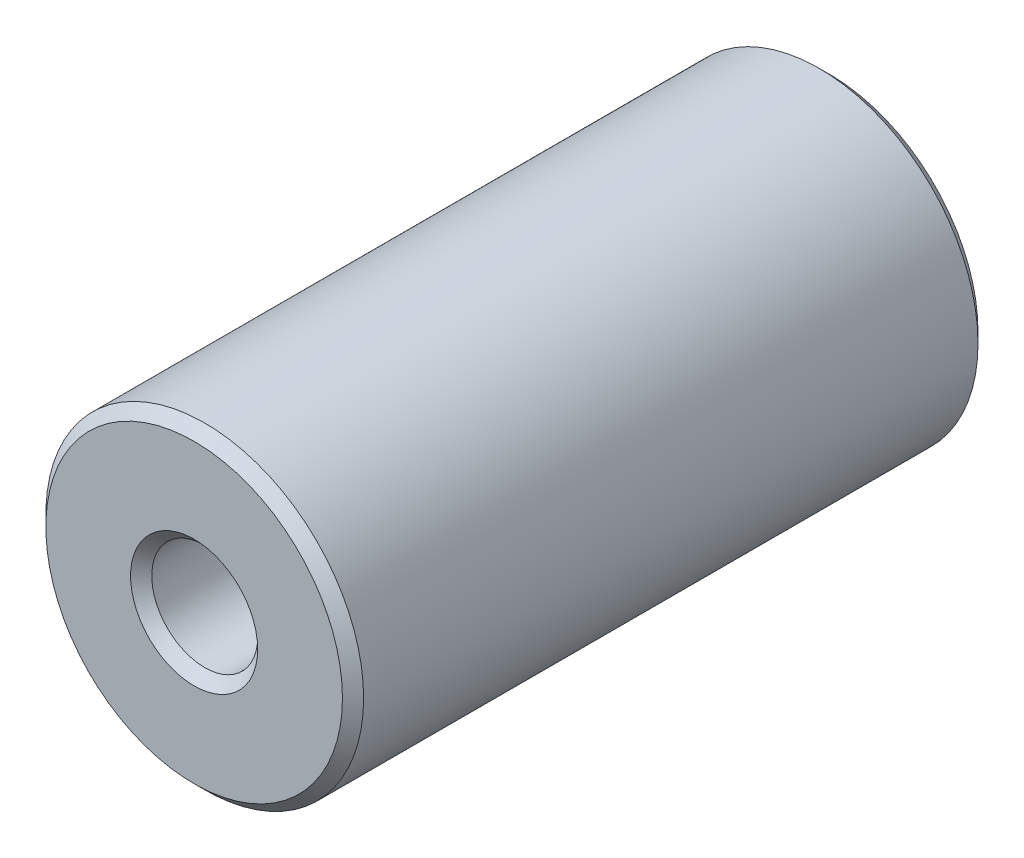
ISO-10303-21;
HEADER;
FILE_DESCRIPTION(('STEP AP214'),'2;1');
FILE_NAME('part.step','',(''),(''),'','','');
FILE_SCHEMA(('AUTOMOTIVE_DESIGN { 1 0 10303 214 1 1 1 1 }'));
ENDSEC;
DATA;
#1=APPLICATION_CONTEXT('core data for automotive mechanical design processes');
#2=APPLICATION_PROTOCOL_DEFINITION('international standard','automotive_design',2000,#1);
#3=PRODUCT_CONTEXT('',#1,'mechanical');
#4=PRODUCT('Part','Part','',(#3));
#5=PRODUCT_RELATED_PRODUCT_CATEGORY('part','',(#4));
#6=PRODUCT_DEFINITION_FORMATION('','',#4);
#7=PRODUCT_DEFINITION_CONTEXT('part definition',#1,'design');
#8=PRODUCT_DEFINITION('design','',#6,#7);
#9=PRODUCT_DEFINITION_SHAPE('','',#8);
#10=(LENGTH_UNIT() NAMED_UNIT(*) SI_UNIT(.MILLI.,.METRE.));
#11=(NAMED_UNIT(*) PLANE_ANGLE_UNIT() SI_UNIT($,.RADIAN.));
#12=(NAMED_UNIT(*) SI_UNIT($,.STERADIAN.) SOLID_ANGLE_UNIT());
#13=UNCERTAINTY_MEASURE_WITH_UNIT(LENGTH_MEASURE(1.E-05),#10,'distance_accuracy_value','');
#14=(GEOMETRIC_REPRESENTATION_CONTEXT(3) GLOBAL_UNCERTAINTY_ASSIGNED_CONTEXT((#13)) GLOBAL_UNIT_ASSIGNED_CONTEXT((#10,
#11,#12)) REPRESENTATION_CONTEXT('',''));
#15=CARTESIAN_POINT('',(0.,0.,0.));
#16=DIRECTION('',(0.,0.,1.));
#17=DIRECTION('',(1.,0.,0.));
#18=AXIS2_PLACEMENT_3D('',#15,#16,#17);
#19=CARTESIAN_POINT('',(0.,0.,0.));
#20=DIRECTION('',(0.,0.,-1.));
#21=DIRECTION('',(1.,0.,0.));
#22=AXIS2_PLACEMENT_3D('',#19,#20,#21);
#23=CYLINDRICAL_SURFACE('',#22,1.);
#24=DIRECTION('',(0.,0.,1.));
#25=VECTOR('',#24,1.);
#26=CARTESIAN_POINT('',(1.,0.,0.));
#27=LINE('',#26,#25);
#28=CARTESIAN_POINT('',(1.,0.,0.2));
#29=VERTEX_POINT('',#28);
#30=CARTESIAN_POINT('',(1.,0.,11.8));
#31=VERTEX_POINT('',#30);
#32=EDGE_CURVE('E10',#29,#31,#27,.T.);
#33=ORIENTED_EDGE('',*,*,#32,.F.);
#34=CARTESIAN_POINT('',(0.,0.,0.2));
#35=DIRECTION('',(0.,0.,1.));
#36=DIRECTION('',(1.,0.,0.));
#37=AXIS2_PLACEMENT_3D('',#34,#35,#36);
#38=CIRCLE('',#37,1.);
#39=EDGE_CURVE('E94',#29,#29,#38,.T.);
#40=ORIENTED_EDGE('',*,*,#39,.F.);
#41=ORIENTED_EDGE('',*,*,#32,.T.);
#42=CARTESIAN_POINT('',(0.,0.,11.8));
#43=DIRECTION('',(0.,0.,-1.));
#44=DIRECTION('',(1.,0.,0.));
#45=AXIS2_PLACEMENT_3D('',#42,#43,#44);
#46=CIRCLE('',#45,1.);
#47=EDGE_CURVE('E115',#31,#31,#46,.T.);
#48=ORIENTED_EDGE('',*,*,#47,.F.);
#49=EDGE_LOOP('',(#33,#40,#41,#48));
#50=FACE_BOUND('',#49,.T.);
#51=ADVANCED_FACE('F16',(#50),#23,.F.);
#52=CARTESIAN_POINT('',(0.,0.,11.8));
#53=DIRECTION('',(0.,0.,1.));
#54=DIRECTION('',(1.,0.,0.));
#55=AXIS2_PLACEMENT_3D('',#52,#53,#54);
#56=CONICAL_SURFACE('',#55,1.,0.785398163397);
#57=ORIENTED_EDGE('',*,*,#47,.T.);
#58=DIRECTION('',(-0.707106781186548,0.,-0.707106781186548));
#59=VECTOR('',#58,1.);
#60=CARTESIAN_POINT('',(1.,0.,11.8));
#61=LINE('',#60,#59);
#62=CARTESIAN_POINT('',(1.2,0.,12.));
#63=VERTEX_POINT('',#62);
#64=EDGE_CURVE('E19',#63,#31,#61,.T.);
#65=ORIENTED_EDGE('',*,*,#64,.F.);
#66=CARTESIAN_POINT('',(0.,0.,12.));
#67=DIRECTION('',(0.,0.,-1.));
#68=DIRECTION('',(1.,0.,0.));
#69=AXIS2_PLACEMENT_3D('',#66,#67,#68);
#70=CIRCLE('',#69,1.2);
#71=EDGE_CURVE('E97',#63,#63,#70,.T.);
#72=ORIENTED_EDGE('',*,*,#71,.F.);
#73=ORIENTED_EDGE('',*,*,#64,.T.);
#74=EDGE_LOOP('',(#57,#65,#72,#73));
#75=FACE_BOUND('',#74,.T.);
#76=ADVANCED_FACE('F124',(#75),#56,.F.);
#77=CARTESIAN_POINT('',(0.,0.,0.2));
#78=DIRECTION('',(0.,0.,-1.));
#79=DIRECTION('',(1.,0.,0.));
#80=AXIS2_PLACEMENT_3D('',#77,#78,#79);
#81=CONICAL_SURFACE('',#80,1.,0.785398163397);
#82=ORIENTED_EDGE('',*,*,#39,.T.);
#83=DIRECTION('',(-0.707106781186548,0.,0.707106781186548));
#84=VECTOR('',#83,1.);
#85=CARTESIAN_POINT('',(1.,0.,0.2));
#86=LINE('',#85,#84);
#87=CARTESIAN_POINT('',(1.2,0.,0.));
#88=VERTEX_POINT('',#87);
#89=EDGE_CURVE('E96',#88,#29,#86,.T.);
#90=ORIENTED_EDGE('',*,*,#89,.F.);
#91=CARTESIAN_POINT('',(0.,0.,0.));
#92=DIRECTION('',(0.,0.,1.));
#93=DIRECTION('',(1.,0.,0.));
#94=AXIS2_PLACEMENT_3D('',#91,#92,#93);
#95=CIRCLE('',#94,1.2);
#96=EDGE_CURVE('E107',#88,#88,#95,.T.);
#97=ORIENTED_EDGE('',*,*,#96,.F.);
#98=ORIENTED_EDGE('',*,*,#89,.T.);
#99=EDGE_LOOP('',(#82,#90,#97,#98));
#100=FACE_BOUND('',#99,.T.);
#101=ADVANCED_FACE('F130',(#100),#81,.F.);
#102=CARTESIAN_POINT('',(0.,0.,12.));
#103=DIRECTION('',(0.,0.,1.));
#104=DIRECTION('',(1.,0.,0.));
#105=AXIS2_PLACEMENT_3D('',#102,#103,#104);
#106=PLANE('',#105);
#107=ORIENTED_EDGE('',*,*,#71,.T.);
#108=EDGE_LOOP('',(#107));
#109=FACE_BOUND('',#108,.T.);
#110=CARTESIAN_POINT('',(0.,0.,12.));
#111=DIRECTION('',(0.,0.,1.));
#112=DIRECTION('',(1.,0.,0.));
#113=AXIS2_PLACEMENT_3D('',#110,#111,#112);
#114=CIRCLE('',#113,2.8);
#115=CARTESIAN_POINT('',(2.8,0.,12.));
#116=VERTEX_POINT('',#115);
#117=EDGE_CURVE('E104',#116,#116,#114,.T.);
#118=ORIENTED_EDGE('',*,*,#117,.T.);
#119=EDGE_LOOP('',(#118));
#120=FACE_BOUND('',#119,.T.);
#121=ADVANCED_FACE('F126',(#109,#120),#106,.T.);
#122=CARTESIAN_POINT('',(0.,0.,0.));
#123=DIRECTION('',(0.,0.,1.));
#124=DIRECTION('',(1.,0.,0.));
#125=AXIS2_PLACEMENT_3D('',#122,#123,#124);
#126=PLANE('',#125);
#127=ORIENTED_EDGE('',*,*,#96,.T.);
#128=EDGE_LOOP('',(#127));
#129=FACE_BOUND('',#128,.T.);
#130=CARTESIAN_POINT('',(0.,0.,0.));
#131=DIRECTION('',(0.,0.,1.));
#132=DIRECTION('',(1.,0.,0.));
#133=AXIS2_PLACEMENT_3D('',#130,#131,#132);
#134=CIRCLE('',#133,2.8);
#135=CARTESIAN_POINT('',(2.8,0.,0.));
#136=VERTEX_POINT('',#135);
#137=EDGE_CURVE('E74',#136,#136,#134,.T.);
#138=ORIENTED_EDGE('',*,*,#137,.F.);
#139=EDGE_LOOP('',(#138));
#140=FACE_BOUND('',#139,.T.);
#141=ADVANCED_FACE('F129',(#129,#140),#126,.F.);
#142=CARTESIAN_POINT('',(0.,0.,11.8));
#143=DIRECTION('',(0.,0.,-1.));
#144=DIRECTION('',(1.,0.,0.));
#145=AXIS2_PLACEMENT_3D('',#142,#143,#144);
#146=CONICAL_SURFACE('',#145,3.,0.785398163397);
#147=DIRECTION('',(-0.707106781186548,0.,0.707106781186548));
#148=VECTOR('',#147,1.);
#149=CARTESIAN_POINT('',(3.,0.,11.8));
#150=LINE('',#149,#148);
#151=CARTESIAN_POINT('',(3.,0.,11.8));
#152=VERTEX_POINT('',#151);
#153=EDGE_CURVE('E76',#152,#116,#150,.T.);
#154=ORIENTED_EDGE('',*,*,#153,.F.);
#155=CARTESIAN_POINT('',(0.,0.,11.8));
#156=DIRECTION('',(0.,0.,1.));
#157=DIRECTION('',(1.,0.,0.));
#158=AXIS2_PLACEMENT_3D('',#155,#156,#157);
#159=CIRCLE('',#158,3.);
#160=EDGE_CURVE('E84',#152,#152,#159,.T.);
#161=ORIENTED_EDGE('',*,*,#160,.T.);
#162=ORIENTED_EDGE('',*,*,#153,.T.);
#163=ORIENTED_EDGE('',*,*,#117,.F.);
#164=EDGE_LOOP('',(#154,#161,#162,#163));
#165=FACE_BOUND('',#164,.T.);
#166=ADVANCED_FACE('F134',(#165),#146,.T.);
#167=CARTESIAN_POINT('',(0.,0.,0.2));
#168=DIRECTION('',(0.,0.,1.));
#169=DIRECTION('',(1.,0.,0.));
#170=AXIS2_PLACEMENT_3D('',#167,#168,#169);
#171=CONICAL_SURFACE('',#170,3.,0.785398163397);
#172=ORIENTED_EDGE('',*,*,#137,.T.);
#173=DIRECTION('',(-0.707106781186548,0.,-0.707106781186548));
#174=VECTOR('',#173,1.);
#175=CARTESIAN_POINT('',(3.,0.,0.2));
#176=LINE('',#175,#174);
#177=CARTESIAN_POINT('',(3.,0.,0.2));
#178=VERTEX_POINT('',#177);
#179=EDGE_CURVE('E68',#178,#136,#176,.T.);
#180=ORIENTED_EDGE('',*,*,#179,.F.);
#181=CARTESIAN_POINT('',(0.,0.,0.2));
#182=DIRECTION('',(0.,0.,1.));
#183=DIRECTION('',(1.,0.,0.));
#184=AXIS2_PLACEMENT_3D('',#181,#182,#183);
#185=CIRCLE('',#184,3.);
#186=EDGE_CURVE('E71',#178,#178,#185,.T.);
#187=ORIENTED_EDGE('',*,*,#186,.F.);
#188=ORIENTED_EDGE('',*,*,#179,.T.);
#189=EDGE_LOOP('',(#172,#180,#187,#188));
#190=FACE_BOUND('',#189,.T.);
#191=ADVANCED_FACE('F70',(#190),#171,.T.);
#192=CARTESIAN_POINT('',(0.,0.,0.));
#193=DIRECTION('',(0.,0.,1.));
#194=DIRECTION('',(1.,0.,0.));
#195=AXIS2_PLACEMENT_3D('',#192,#193,#194);
#196=CYLINDRICAL_SURFACE('',#195,3.);
#197=DIRECTION('',(0.,0.,1.));
#198=VECTOR('',#197,1.);
#199=CARTESIAN_POINT('',(3.,0.,0.));
#200=LINE('',#199,#198);
#201=EDGE_CURVE('E82',#178,#152,#200,.T.);
#202=ORIENTED_EDGE('',*,*,#201,.F.);
#203=ORIENTED_EDGE('',*,*,#186,.T.);
#204=ORIENTED_EDGE('',*,*,#201,.T.);
#205=ORIENTED_EDGE('',*,*,#160,.F.);
#206=EDGE_LOOP('',(#202,#203,#204,#205));
#207=FACE_BOUND('',#206,.T.);
#208=ADVANCED_FACE('F80',(#207),#196,.T.);
#209=CLOSED_SHELL('',(#51,#76,#101,#121,#141,#166,#191,#208));
#210=MANIFOLD_SOLID_BREP('B1',#209);
#211=ADVANCED_BREP_SHAPE_REPRESENTATION('',(#18,#210),#14);
#212=SHAPE_DEFINITION_REPRESENTATION(#9,#211);
ENDSEC;
END-ISO-10303-21;
